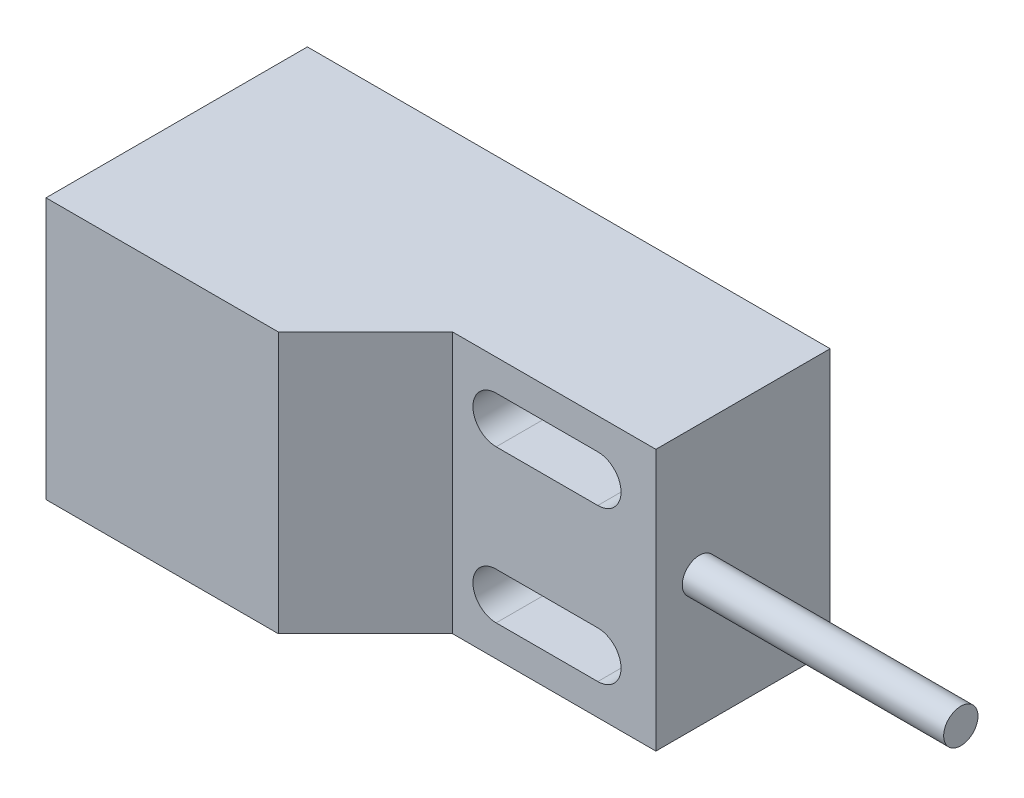
ISO-10303-21;
HEADER;
FILE_DESCRIPTION(('STEP AP214'),'2;1');
FILE_NAME('part.step','',(''),(''),'','','');
FILE_SCHEMA(('AUTOMOTIVE_DESIGN { 1 0 10303 214 1 1 1 1 }'));
ENDSEC;
DATA;
#1=APPLICATION_CONTEXT('core data for automotive mechanical design processes');
#2=APPLICATION_PROTOCOL_DEFINITION('international standard','automotive_design',2000,#1);
#3=PRODUCT_CONTEXT('',#1,'mechanical');
#4=PRODUCT('Part','Part','',(#3));
#5=PRODUCT_RELATED_PRODUCT_CATEGORY('part','',(#4));
#6=PRODUCT_DEFINITION_FORMATION('','',#4);
#7=PRODUCT_DEFINITION_CONTEXT('part definition',#1,'design');
#8=PRODUCT_DEFINITION('design','',#6,#7);
#9=PRODUCT_DEFINITION_SHAPE('','',#8);
#10=(LENGTH_UNIT() NAMED_UNIT(*) SI_UNIT(.MILLI.,.METRE.));
#11=(NAMED_UNIT(*) PLANE_ANGLE_UNIT() SI_UNIT($,.RADIAN.));
#12=(NAMED_UNIT(*) SI_UNIT($,.STERADIAN.) SOLID_ANGLE_UNIT());
#13=UNCERTAINTY_MEASURE_WITH_UNIT(LENGTH_MEASURE(1.E-05),#10,'distance_accuracy_value','');
#14=(GEOMETRIC_REPRESENTATION_CONTEXT(3) GLOBAL_UNCERTAINTY_ASSIGNED_CONTEXT((#13)) GLOBAL_UNIT_ASSIGNED_CONTEXT((#10,
#11,#12)) REPRESENTATION_CONTEXT('',''));
#15=CARTESIAN_POINT('',(0.,0.,0.));
#16=DIRECTION('',(0.,0.,1.));
#17=DIRECTION('',(1.,0.,0.));
#18=AXIS2_PLACEMENT_3D('',#15,#16,#17);
#19=CARTESIAN_POINT('',(18.,9.,9.));
#20=DIRECTION('',(-1.,0.,0.));
#21=DIRECTION('',(0.,0.,1.));
#22=AXIS2_PLACEMENT_3D('',#19,#20,#21);
#23=PLANE('',#22);
#24=CARTESIAN_POINT('',(18.,0.,0.));
#25=DIRECTION('',(-1.,0.,0.));
#26=DIRECTION('',(0.,0.,1.));
#27=AXIS2_PLACEMENT_3D('',#24,#25,#26);
#28=CIRCLE('',#27,1.18261281778891);
#29=CARTESIAN_POINT('',(18.,0.,1.18261281778891));
#30=VERTEX_POINT('',#29);
#31=EDGE_CURVE('E11',#30,#30,#28,.F.);
#32=ORIENTED_EDGE('',*,*,#31,.F.);
#33=EDGE_LOOP('',(#32));
#34=FACE_BOUND('',#33,.T.);
#35=DIRECTION('',(0.,0.,-1.));
#36=VECTOR('',#35,1.);
#37=CARTESIAN_POINT('',(18.,9.,9.));
#38=LINE('',#37,#36);
#39=CARTESIAN_POINT('',(18.,9.,3.));
#40=VERTEX_POINT('',#39);
#41=CARTESIAN_POINT('',(18.,9.,-9.));
#42=VERTEX_POINT('',#41);
#43=EDGE_CURVE('E40',#40,#42,#38,.T.);
#44=ORIENTED_EDGE('',*,*,#43,.F.);
#45=DIRECTION('',(0.,-1.,0.));
#46=VECTOR('',#45,1.);
#47=CARTESIAN_POINT('',(18.,9.,3.));
#48=LINE('',#47,#46);
#49=CARTESIAN_POINT('',(18.,-9.,3.));
#50=VERTEX_POINT('',#49);
#51=EDGE_CURVE('E218',#40,#50,#48,.T.);
#52=ORIENTED_EDGE('',*,*,#51,.T.);
#53=DIRECTION('',(0.,0.,-1.));
#54=VECTOR('',#53,1.);
#55=CARTESIAN_POINT('',(18.,-9.,9.));
#56=LINE('',#55,#54);
#57=CARTESIAN_POINT('',(18.,-9.,-9.));
#58=VERTEX_POINT('',#57);
#59=EDGE_CURVE('E233',#50,#58,#56,.T.);
#60=ORIENTED_EDGE('',*,*,#59,.T.);
#61=DIRECTION('',(0.,1.,0.));
#62=VECTOR('',#61,1.);
#63=CARTESIAN_POINT('',(18.,9.,-9.));
#64=LINE('',#63,#62);
#65=EDGE_CURVE('E221',#58,#42,#64,.T.);
#66=ORIENTED_EDGE('',*,*,#65,.T.);
#67=EDGE_LOOP('',(#44,#52,#60,#66));
#68=FACE_BOUND('',#67,.T.);
#69=ADVANCED_FACE('F33',(#34,#68),#23,.F.);
#70=CARTESIAN_POINT('',(-18.,9.,9.));
#71=DIRECTION('',(0.,-1.,0.));
#72=DIRECTION('',(0.,0.,-1.));
#73=AXIS2_PLACEMENT_3D('',#70,#71,#72);
#74=PLANE('',#73);
#75=DIRECTION('',(0.707106781186551,0.,-0.707106781186543));
#76=VECTOR('',#75,1.);
#77=CARTESIAN_POINT('',(-1.99999999999999,9.,9.));
#78=LINE('',#77,#76);
#79=CARTESIAN_POINT('',(-1.99999999999999,9.,9.));
#80=VERTEX_POINT('',#79);
#81=CARTESIAN_POINT('',(4.00000000000007,9.,3.));
#82=VERTEX_POINT('',#81);
#83=EDGE_CURVE('E207',#80,#82,#78,.T.);
#84=ORIENTED_EDGE('',*,*,#83,.T.);
#85=DIRECTION('',(1.,0.,0.));
#86=VECTOR('',#85,1.);
#87=CARTESIAN_POINT('',(4.00000000000007,9.,3.));
#88=LINE('',#87,#86);
#89=EDGE_CURVE('E210',#82,#40,#88,.T.);
#90=ORIENTED_EDGE('',*,*,#89,.T.);
#91=ORIENTED_EDGE('',*,*,#43,.T.);
#92=DIRECTION('',(-1.,0.,0.));
#93=VECTOR('',#92,1.);
#94=CARTESIAN_POINT('',(-18.,9.,-9.));
#95=LINE('',#94,#93);
#96=CARTESIAN_POINT('',(-18.,9.,-9.));
#97=VERTEX_POINT('',#96);
#98=EDGE_CURVE('E236',#42,#97,#95,.T.);
#99=ORIENTED_EDGE('',*,*,#98,.T.);
#100=DIRECTION('',(0.,0.,-1.));
#101=VECTOR('',#100,1.);
#102=CARTESIAN_POINT('',(-18.,9.,9.));
#103=LINE('',#102,#101);
#104=CARTESIAN_POINT('',(-18.,9.,9.));
#105=VERTEX_POINT('',#104);
#106=EDGE_CURVE('E246',#105,#97,#103,.T.);
#107=ORIENTED_EDGE('',*,*,#106,.F.);
#108=DIRECTION('',(-1.,0.,0.));
#109=VECTOR('',#108,1.);
#110=CARTESIAN_POINT('',(-18.,9.,9.));
#111=LINE('',#110,#109);
#112=EDGE_CURVE('E225',#80,#105,#111,.T.);
#113=ORIENTED_EDGE('',*,*,#112,.F.);
#114=EDGE_LOOP('',(#84,#90,#91,#99,#107,#113));
#115=FACE_BOUND('',#114,.T.);
#116=ADVANCED_FACE('F251',(#115),#74,.F.);
#117=CARTESIAN_POINT('',(-18.,9.,9.));
#118=DIRECTION('',(1.,0.,0.));
#119=DIRECTION('',(0.,0.,-1.));
#120=AXIS2_PLACEMENT_3D('',#117,#118,#119);
#121=PLANE('',#120);
#122=DIRECTION('',(0.,-1.,0.));
#123=VECTOR('',#122,1.);
#124=CARTESIAN_POINT('',(-18.,9.,-9.));
#125=LINE('',#124,#123);
#126=CARTESIAN_POINT('',(-18.,-9.,-9.));
#127=VERTEX_POINT('',#126);
#128=EDGE_CURVE('E238',#97,#127,#125,.T.);
#129=ORIENTED_EDGE('',*,*,#128,.T.);
#130=DIRECTION('',(0.,0.,-1.));
#131=VECTOR('',#130,1.);
#132=CARTESIAN_POINT('',(-18.,-9.,9.));
#133=LINE('',#132,#131);
#134=CARTESIAN_POINT('',(-18.,-9.,9.));
#135=VERTEX_POINT('',#134);
#136=EDGE_CURVE('E243',#135,#127,#133,.T.);
#137=ORIENTED_EDGE('',*,*,#136,.F.);
#138=DIRECTION('',(0.,-1.,0.));
#139=VECTOR('',#138,1.);
#140=CARTESIAN_POINT('',(-18.,9.,9.));
#141=LINE('',#140,#139);
#142=EDGE_CURVE('E227',#105,#135,#141,.T.);
#143=ORIENTED_EDGE('',*,*,#142,.F.);
#144=ORIENTED_EDGE('',*,*,#106,.T.);
#145=EDGE_LOOP('',(#129,#137,#143,#144));
#146=FACE_BOUND('',#145,.T.);
#147=ADVANCED_FACE('F268',(#146),#121,.F.);
#148=CARTESIAN_POINT('',(-18.,-9.,9.));
#149=DIRECTION('',(0.,1.,0.));
#150=DIRECTION('',(0.,0.,1.));
#151=AXIS2_PLACEMENT_3D('',#148,#149,#150);
#152=PLANE('',#151);
#153=ORIENTED_EDGE('',*,*,#59,.F.);
#154=DIRECTION('',(1.,0.,0.));
#155=VECTOR('',#154,1.);
#156=CARTESIAN_POINT('',(4.00000000000007,-9.,3.));
#157=LINE('',#156,#155);
#158=CARTESIAN_POINT('',(4.00000000000007,-9.,3.));
#159=VERTEX_POINT('',#158);
#160=EDGE_CURVE('E211',#159,#50,#157,.T.);
#161=ORIENTED_EDGE('',*,*,#160,.F.);
#162=DIRECTION('',(0.707106781186551,0.,-0.707106781186543));
#163=VECTOR('',#162,1.);
#164=CARTESIAN_POINT('',(-1.99999999999999,-9.,9.));
#165=LINE('',#164,#163);
#166=CARTESIAN_POINT('',(-1.99999999999999,-9.,9.));
#167=VERTEX_POINT('',#166);
#168=EDGE_CURVE('E206',#167,#159,#165,.T.);
#169=ORIENTED_EDGE('',*,*,#168,.F.);
#170=DIRECTION('',(1.,0.,0.));
#171=VECTOR('',#170,1.);
#172=CARTESIAN_POINT('',(-18.,-9.,9.));
#173=LINE('',#172,#171);
#174=EDGE_CURVE('E230',#135,#167,#173,.T.);
#175=ORIENTED_EDGE('',*,*,#174,.F.);
#176=ORIENTED_EDGE('',*,*,#136,.T.);
#177=DIRECTION('',(1.,0.,0.));
#178=VECTOR('',#177,1.);
#179=CARTESIAN_POINT('',(-18.,-9.,-9.));
#180=LINE('',#179,#178);
#181=EDGE_CURVE('E228',#127,#58,#180,.T.);
#182=ORIENTED_EDGE('',*,*,#181,.T.);
#183=EDGE_LOOP('',(#153,#161,#169,#175,#176,#182));
#184=FACE_BOUND('',#183,.T.);
#185=ADVANCED_FACE('F262',(#184),#152,.F.);
#186=CARTESIAN_POINT('',(0.,0.,9.));
#187=DIRECTION('',(0.,0.,1.));
#188=DIRECTION('',(1.,0.,0.));
#189=AXIS2_PLACEMENT_3D('',#186,#187,#188);
#190=PLANE('',#189);
#191=DIRECTION('',(0.,-1.,0.));
#192=VECTOR('',#191,1.);
#193=CARTESIAN_POINT('',(-1.99999999999999,9.,9.));
#194=LINE('',#193,#192);
#195=EDGE_CURVE('E214',#80,#167,#194,.T.);
#196=ORIENTED_EDGE('',*,*,#195,.F.);
#197=ORIENTED_EDGE('',*,*,#112,.T.);
#198=ORIENTED_EDGE('',*,*,#142,.T.);
#199=ORIENTED_EDGE('',*,*,#174,.T.);
#200=EDGE_LOOP('',(#196,#197,#198,#199));
#201=FACE_BOUND('',#200,.T.);
#202=ADVANCED_FACE('F272',(#201),#190,.T.);
#203=CARTESIAN_POINT('',(0.,0.,-9.));
#204=DIRECTION('',(0.,0.,1.));
#205=DIRECTION('',(1.,0.,0.));
#206=AXIS2_PLACEMENT_3D('',#203,#204,#205);
#207=PLANE('',#206);
#208=DIRECTION('',(-1.,0.,0.));
#209=VECTOR('',#208,1.);
#210=CARTESIAN_POINT('',(7.00000000000001,6.85,-9.));
#211=LINE('',#210,#209);
#212=CARTESIAN_POINT('',(14.,6.85,-9.));
#213=VERTEX_POINT('',#212);
#214=CARTESIAN_POINT('',(7.00000000000001,6.85,-9.));
#215=VERTEX_POINT('',#214);
#216=EDGE_CURVE('E145',#213,#215,#211,.T.);
#217=ORIENTED_EDGE('',*,*,#216,.T.);
#218=CARTESIAN_POINT('',(7.00000000000001,5.25,-9.));
#219=DIRECTION('',(0.,0.,1.));
#220=DIRECTION('',(1.,0.,0.));
#221=AXIS2_PLACEMENT_3D('',#218,#219,#220);
#222=CIRCLE('',#221,1.6);
#223=CARTESIAN_POINT('',(7.00000000000001,3.65,-9.));
#224=VERTEX_POINT('',#223);
#225=EDGE_CURVE('E137',#215,#224,#222,.T.);
#226=ORIENTED_EDGE('',*,*,#225,.T.);
#227=DIRECTION('',(1.,0.,0.));
#228=VECTOR('',#227,1.);
#229=CARTESIAN_POINT('',(7.00000000000001,3.65,-9.));
#230=LINE('',#229,#228);
#231=CARTESIAN_POINT('',(14.,3.65,-9.));
#232=VERTEX_POINT('',#231);
#233=EDGE_CURVE('E148',#224,#232,#230,.T.);
#234=ORIENTED_EDGE('',*,*,#233,.T.);
#235=CARTESIAN_POINT('',(14.,5.25,-9.));
#236=DIRECTION('',(0.,0.,1.));
#237=DIRECTION('',(1.,0.,0.));
#238=AXIS2_PLACEMENT_3D('',#235,#236,#237);
#239=CIRCLE('',#238,1.6);
#240=EDGE_CURVE('E47',#232,#213,#239,.T.);
#241=ORIENTED_EDGE('',*,*,#240,.T.);
#242=EDGE_LOOP('',(#217,#226,#234,#241));
#243=FACE_BOUND('',#242,.T.);
#244=DIRECTION('',(-1.,0.,0.));
#245=VECTOR('',#244,1.);
#246=CARTESIAN_POINT('',(7.00000000000001,-3.65,-9.));
#247=LINE('',#246,#245);
#248=CARTESIAN_POINT('',(14.,-3.65,-9.));
#249=VERTEX_POINT('',#248);
#250=CARTESIAN_POINT('',(7.00000000000001,-3.65,-9.));
#251=VERTEX_POINT('',#250);
#252=EDGE_CURVE('E183',#249,#251,#247,.T.);
#253=ORIENTED_EDGE('',*,*,#252,.T.);
#254=CARTESIAN_POINT('',(7.00000000000001,-5.25,-9.));
#255=DIRECTION('',(0.,0.,1.));
#256=DIRECTION('',(-1.,0.,0.));
#257=AXIS2_PLACEMENT_3D('',#254,#255,#256);
#258=CIRCLE('',#257,1.6);
#259=CARTESIAN_POINT('',(7.00000000000001,-6.85,-9.));
#260=VERTEX_POINT('',#259);
#261=EDGE_CURVE('E175',#251,#260,#258,.T.);
#262=ORIENTED_EDGE('',*,*,#261,.T.);
#263=DIRECTION('',(1.,0.,0.));
#264=VECTOR('',#263,1.);
#265=CARTESIAN_POINT('',(7.00000000000001,-6.85,-9.));
#266=LINE('',#265,#264);
#267=CARTESIAN_POINT('',(14.,-6.85,-9.));
#268=VERTEX_POINT('',#267);
#269=EDGE_CURVE('E178',#260,#268,#266,.T.);
#270=ORIENTED_EDGE('',*,*,#269,.T.);
#271=CARTESIAN_POINT('',(14.,-5.25,-9.));
#272=DIRECTION('',(0.,0.,1.));
#273=DIRECTION('',(-1.,0.,0.));
#274=AXIS2_PLACEMENT_3D('',#271,#272,#273);
#275=CIRCLE('',#274,1.6);
#276=EDGE_CURVE('E55',#268,#249,#275,.T.);
#277=ORIENTED_EDGE('',*,*,#276,.T.);
#278=EDGE_LOOP('',(#253,#262,#270,#277));
#279=FACE_BOUND('',#278,.T.);
#280=ORIENTED_EDGE('',*,*,#65,.F.);
#281=ORIENTED_EDGE('',*,*,#181,.F.);
#282=ORIENTED_EDGE('',*,*,#128,.F.);
#283=ORIENTED_EDGE('',*,*,#98,.F.);
#284=EDGE_LOOP('',(#280,#281,#282,#283));
#285=FACE_BOUND('',#284,.T.);
#286=ADVANCED_FACE('F152',(#243,#279,#285),#207,.F.);
#287=CARTESIAN_POINT('',(4.00000000000007,9.,3.));
#288=DIRECTION('',(0.,0.,-1.));
#289=DIRECTION('',(-1.,0.,0.));
#290=AXIS2_PLACEMENT_3D('',#287,#288,#289);
#291=PLANE('',#290);
#292=DIRECTION('',(1.,0.,0.));
#293=VECTOR('',#292,1.);
#294=CARTESIAN_POINT('',(7.00000000000001,3.65,3.));
#295=LINE('',#294,#293);
#296=CARTESIAN_POINT('',(7.00000000000001,3.65,3.));
#297=VERTEX_POINT('',#296);
#298=CARTESIAN_POINT('',(14.,3.65,3.));
#299=VERTEX_POINT('',#298);
#300=EDGE_CURVE('E164',#297,#299,#295,.T.);
#301=ORIENTED_EDGE('',*,*,#300,.F.);
#302=CARTESIAN_POINT('',(7.00000000000001,5.25,3.));
#303=DIRECTION('',(0.,0.,1.));
#304=DIRECTION('',(1.,0.,0.));
#305=AXIS2_PLACEMENT_3D('',#302,#303,#304);
#306=CIRCLE('',#305,1.6);
#307=CARTESIAN_POINT('',(7.00000000000001,6.85,3.));
#308=VERTEX_POINT('',#307);
#309=EDGE_CURVE('E140',#308,#297,#306,.T.);
#310=ORIENTED_EDGE('',*,*,#309,.F.);
#311=DIRECTION('',(-1.,0.,0.));
#312=VECTOR('',#311,1.);
#313=CARTESIAN_POINT('',(7.00000000000001,6.85,3.));
#314=LINE('',#313,#312);
#315=CARTESIAN_POINT('',(14.,6.85,3.));
#316=VERTEX_POINT('',#315);
#317=EDGE_CURVE('E155',#316,#308,#314,.T.);
#318=ORIENTED_EDGE('',*,*,#317,.F.);
#319=CARTESIAN_POINT('',(14.,5.25,3.));
#320=DIRECTION('',(0.,0.,1.));
#321=DIRECTION('',(1.,0.,0.));
#322=AXIS2_PLACEMENT_3D('',#319,#320,#321);
#323=CIRCLE('',#322,1.6);
#324=EDGE_CURVE('E158',#299,#316,#323,.T.);
#325=ORIENTED_EDGE('',*,*,#324,.F.);
#326=EDGE_LOOP('',(#301,#310,#318,#325));
#327=FACE_BOUND('',#326,.T.);
#328=DIRECTION('',(1.,0.,0.));
#329=VECTOR('',#328,1.);
#330=CARTESIAN_POINT('',(7.00000000000001,-6.85,3.));
#331=LINE('',#330,#329);
#332=CARTESIAN_POINT('',(7.00000000000001,-6.85,3.));
#333=VERTEX_POINT('',#332);
#334=CARTESIAN_POINT('',(14.,-6.85,3.));
#335=VERTEX_POINT('',#334);
#336=EDGE_CURVE('E189',#333,#335,#331,.T.);
#337=ORIENTED_EDGE('',*,*,#336,.F.);
#338=CARTESIAN_POINT('',(7.00000000000001,-5.25,3.));
#339=DIRECTION('',(0.,0.,1.));
#340=DIRECTION('',(-1.,0.,0.));
#341=AXIS2_PLACEMENT_3D('',#338,#339,#340);
#342=CIRCLE('',#341,1.6);
#343=CARTESIAN_POINT('',(7.00000000000001,-3.65,3.));
#344=VERTEX_POINT('',#343);
#345=EDGE_CURVE('E187',#344,#333,#342,.T.);
#346=ORIENTED_EDGE('',*,*,#345,.F.);
#347=DIRECTION('',(-1.,0.,0.));
#348=VECTOR('',#347,1.);
#349=CARTESIAN_POINT('',(7.00000000000001,-3.65,3.));
#350=LINE('',#349,#348);
#351=CARTESIAN_POINT('',(14.,-3.65,3.));
#352=VERTEX_POINT('',#351);
#353=EDGE_CURVE('E179',#352,#344,#350,.T.);
#354=ORIENTED_EDGE('',*,*,#353,.F.);
#355=CARTESIAN_POINT('',(14.,-5.25,3.));
#356=DIRECTION('',(0.,0.,1.));
#357=DIRECTION('',(-1.,0.,0.));
#358=AXIS2_PLACEMENT_3D('',#355,#356,#357);
#359=CIRCLE('',#358,1.6);
#360=EDGE_CURVE('E192',#335,#352,#359,.T.);
#361=ORIENTED_EDGE('',*,*,#360,.F.);
#362=EDGE_LOOP('',(#337,#346,#354,#361));
#363=FACE_BOUND('',#362,.T.);
#364=ORIENTED_EDGE('',*,*,#160,.T.);
#365=ORIENTED_EDGE('',*,*,#51,.F.);
#366=ORIENTED_EDGE('',*,*,#89,.F.);
#367=DIRECTION('',(0.,-1.,0.));
#368=VECTOR('',#367,1.);
#369=CARTESIAN_POINT('',(4.00000000000007,9.,3.));
#370=LINE('',#369,#368);
#371=EDGE_CURVE('E222',#82,#159,#370,.T.);
#372=ORIENTED_EDGE('',*,*,#371,.T.);
#373=EDGE_LOOP('',(#364,#365,#366,#372));
#374=FACE_BOUND('',#373,.T.);
#375=ADVANCED_FACE('F276',(#327,#363,#374),#291,.F.);
#376=CARTESIAN_POINT('',(-1.99999999999999,9.,9.));
#377=DIRECTION('',(-0.707106781186544,0.,-0.707106781186552));
#378=DIRECTION('',(-0.707106781186552,0.,0.707106781186544));
#379=AXIS2_PLACEMENT_3D('',#376,#377,#378);
#380=PLANE('',#379);
#381=ORIENTED_EDGE('',*,*,#168,.T.);
#382=ORIENTED_EDGE('',*,*,#371,.F.);
#383=ORIENTED_EDGE('',*,*,#83,.F.);
#384=ORIENTED_EDGE('',*,*,#195,.T.);
#385=EDGE_LOOP('',(#381,#382,#383,#384));
#386=FACE_BOUND('',#385,.T.);
#387=ADVANCED_FACE('F274',(#386),#380,.F.);
#388=CARTESIAN_POINT('',(36.,0.,0.));
#389=DIRECTION('',(-1.,0.,0.));
#390=DIRECTION('',(0.,0.,1.));
#391=AXIS2_PLACEMENT_3D('',#388,#389,#390);
#392=CYLINDRICAL_SURFACE('',#391,1.18261281778891);
#393=CARTESIAN_POINT('',(36.,0.,0.));
#394=DIRECTION('',(1.,0.,0.));
#395=DIRECTION('',(0.,0.,-1.));
#396=AXIS2_PLACEMENT_3D('',#393,#394,#395);
#397=CIRCLE('',#396,1.18261281778891);
#398=CARTESIAN_POINT('',(36.,0.,-1.18261281778891));
#399=VERTEX_POINT('',#398);
#400=EDGE_CURVE('E171',#399,#399,#397,.T.);
#401=ORIENTED_EDGE('',*,*,#400,.F.);
#402=EDGE_LOOP('',(#401));
#403=FACE_BOUND('',#402,.T.);
#404=ORIENTED_EDGE('',*,*,#31,.T.);
#405=EDGE_LOOP('',(#404));
#406=FACE_BOUND('',#405,.T.);
#407=ADVANCED_FACE('F284',(#403,#406),#392,.T.);
#408=CARTESIAN_POINT('',(36.,0.,0.));
#409=DIRECTION('',(1.,0.,0.));
#410=DIRECTION('',(0.,0.,-1.));
#411=AXIS2_PLACEMENT_3D('',#408,#409,#410);
#412=PLANE('',#411);
#413=ORIENTED_EDGE('',*,*,#400,.T.);
#414=EDGE_LOOP('',(#413));
#415=FACE_BOUND('',#414,.T.);
#416=ADVANCED_FACE('F297',(#415),#412,.T.);
#417=CARTESIAN_POINT('',(7.00000000000001,-5.25,-9.));
#418=DIRECTION('',(0.,0.,1.));
#419=DIRECTION('',(1.,0.,0.));
#420=AXIS2_PLACEMENT_3D('',#417,#418,#419);
#421=CYLINDRICAL_SURFACE('',#420,1.6);
#422=ORIENTED_EDGE('',*,*,#345,.T.);
#423=DIRECTION('',(0.,0.,1.));
#424=VECTOR('',#423,1.);
#425=CARTESIAN_POINT('',(7.00000000000001,-6.85,-9.));
#426=LINE('',#425,#424);
#427=EDGE_CURVE('E186',#260,#333,#426,.T.);
#428=ORIENTED_EDGE('',*,*,#427,.F.);
#429=ORIENTED_EDGE('',*,*,#261,.F.);
#430=DIRECTION('',(0.,0.,1.));
#431=VECTOR('',#430,1.);
#432=CARTESIAN_POINT('',(7.00000000000001,-3.65,-9.));
#433=LINE('',#432,#431);
#434=EDGE_CURVE('E165',#251,#344,#433,.T.);
#435=ORIENTED_EDGE('',*,*,#434,.T.);
#436=EDGE_LOOP('',(#422,#428,#429,#435));
#437=FACE_BOUND('',#436,.T.);
#438=ADVANCED_FACE('F302',(#437),#421,.F.);
#439=CARTESIAN_POINT('',(7.00000000000001,-3.65,-9.));
#440=DIRECTION('',(0.,1.,0.));
#441=DIRECTION('',(0.,0.,1.));
#442=AXIS2_PLACEMENT_3D('',#439,#440,#441);
#443=PLANE('',#442);
#444=ORIENTED_EDGE('',*,*,#353,.T.);
#445=ORIENTED_EDGE('',*,*,#434,.F.);
#446=ORIENTED_EDGE('',*,*,#252,.F.);
#447=DIRECTION('',(0.,0.,1.));
#448=VECTOR('',#447,1.);
#449=CARTESIAN_POINT('',(14.,-3.65,-9.));
#450=LINE('',#449,#448);
#451=EDGE_CURVE('E198',#249,#352,#450,.T.);
#452=ORIENTED_EDGE('',*,*,#451,.T.);
#453=EDGE_LOOP('',(#444,#445,#446,#452));
#454=FACE_BOUND('',#453,.T.);
#455=ADVANCED_FACE('F309',(#454),#443,.F.);
#456=CARTESIAN_POINT('',(14.,-5.25,-9.));
#457=DIRECTION('',(0.,0.,1.));
#458=DIRECTION('',(1.,0.,0.));
#459=AXIS2_PLACEMENT_3D('',#456,#457,#458);
#460=CYLINDRICAL_SURFACE('',#459,1.6);
#461=ORIENTED_EDGE('',*,*,#360,.T.);
#462=ORIENTED_EDGE('',*,*,#451,.F.);
#463=ORIENTED_EDGE('',*,*,#276,.F.);
#464=DIRECTION('',(0.,0.,1.));
#465=VECTOR('',#464,1.);
#466=CARTESIAN_POINT('',(14.,-6.85,-9.));
#467=LINE('',#466,#465);
#468=EDGE_CURVE('E200',#268,#335,#467,.T.);
#469=ORIENTED_EDGE('',*,*,#468,.T.);
#470=EDGE_LOOP('',(#461,#462,#463,#469));
#471=FACE_BOUND('',#470,.T.);
#472=ADVANCED_FACE('F314',(#471),#460,.F.);
#473=CARTESIAN_POINT('',(7.00000000000001,-6.85,-9.));
#474=DIRECTION('',(0.,-1.,0.));
#475=DIRECTION('',(0.,0.,-1.));
#476=AXIS2_PLACEMENT_3D('',#473,#474,#475);
#477=PLANE('',#476);
#478=ORIENTED_EDGE('',*,*,#336,.T.);
#479=ORIENTED_EDGE('',*,*,#468,.F.);
#480=ORIENTED_EDGE('',*,*,#269,.F.);
#481=ORIENTED_EDGE('',*,*,#427,.T.);
#482=EDGE_LOOP('',(#478,#479,#480,#481));
#483=FACE_BOUND('',#482,.T.);
#484=ADVANCED_FACE('F311',(#483),#477,.F.);
#485=CARTESIAN_POINT('',(7.00000000000001,5.25,-9.));
#486=DIRECTION('',(0.,0.,1.));
#487=DIRECTION('',(1.,0.,0.));
#488=AXIS2_PLACEMENT_3D('',#485,#486,#487);
#489=CYLINDRICAL_SURFACE('',#488,1.6);
#490=ORIENTED_EDGE('',*,*,#309,.T.);
#491=DIRECTION('',(0.,0.,1.));
#492=VECTOR('',#491,1.);
#493=CARTESIAN_POINT('',(7.00000000000001,3.65,-9.));
#494=LINE('',#493,#492);
#495=EDGE_CURVE('E133',#224,#297,#494,.T.);
#496=ORIENTED_EDGE('',*,*,#495,.F.);
#497=ORIENTED_EDGE('',*,*,#225,.F.);
#498=DIRECTION('',(0.,0.,1.));
#499=VECTOR('',#498,1.);
#500=CARTESIAN_POINT('',(7.00000000000001,6.85,-9.));
#501=LINE('',#500,#499);
#502=EDGE_CURVE('E169',#215,#308,#501,.T.);
#503=ORIENTED_EDGE('',*,*,#502,.T.);
#504=EDGE_LOOP('',(#490,#496,#497,#503));
#505=FACE_BOUND('',#504,.T.);
#506=ADVANCED_FACE('F135',(#505),#489,.F.);
#507=CARTESIAN_POINT('',(7.00000000000001,6.85,-9.));
#508=DIRECTION('',(0.,1.,0.));
#509=DIRECTION('',(0.,0.,1.));
#510=AXIS2_PLACEMENT_3D('',#507,#508,#509);
#511=PLANE('',#510);
#512=ORIENTED_EDGE('',*,*,#317,.T.);
#513=ORIENTED_EDGE('',*,*,#502,.F.);
#514=ORIENTED_EDGE('',*,*,#216,.F.);
#515=DIRECTION('',(0.,0.,1.));
#516=VECTOR('',#515,1.);
#517=CARTESIAN_POINT('',(14.,6.85,-9.));
#518=LINE('',#517,#516);
#519=EDGE_CURVE('E172',#213,#316,#518,.T.);
#520=ORIENTED_EDGE('',*,*,#519,.T.);
#521=EDGE_LOOP('',(#512,#513,#514,#520));
#522=FACE_BOUND('',#521,.T.);
#523=ADVANCED_FACE('F323',(#522),#511,.F.);
#524=CARTESIAN_POINT('',(14.,5.25,-9.));
#525=DIRECTION('',(0.,0.,1.));
#526=DIRECTION('',(1.,0.,0.));
#527=AXIS2_PLACEMENT_3D('',#524,#525,#526);
#528=CYLINDRICAL_SURFACE('',#527,1.6);
#529=ORIENTED_EDGE('',*,*,#324,.T.);
#530=ORIENTED_EDGE('',*,*,#519,.F.);
#531=ORIENTED_EDGE('',*,*,#240,.F.);
#532=DIRECTION('',(0.,0.,1.));
#533=VECTOR('',#532,1.);
#534=CARTESIAN_POINT('',(14.,3.65,-9.));
#535=LINE('',#534,#533);
#536=EDGE_CURVE('E144',#232,#299,#535,.T.);
#537=ORIENTED_EDGE('',*,*,#536,.T.);
#538=EDGE_LOOP('',(#529,#530,#531,#537));
#539=FACE_BOUND('',#538,.T.);
#540=ADVANCED_FACE('F326',(#539),#528,.F.);
#541=CARTESIAN_POINT('',(7.00000000000001,3.65,-9.));
#542=DIRECTION('',(0.,-1.,0.));
#543=DIRECTION('',(0.,0.,-1.));
#544=AXIS2_PLACEMENT_3D('',#541,#542,#543);
#545=PLANE('',#544);
#546=ORIENTED_EDGE('',*,*,#300,.T.);
#547=ORIENTED_EDGE('',*,*,#536,.F.);
#548=ORIENTED_EDGE('',*,*,#233,.F.);
#549=ORIENTED_EDGE('',*,*,#495,.T.);
#550=EDGE_LOOP('',(#546,#547,#548,#549));
#551=FACE_BOUND('',#550,.T.);
#552=ADVANCED_FACE('F149',(#551),#545,.F.);
#553=CLOSED_SHELL('',(#69,#116,#147,#185,#202,#286,#375,#387,#407,#416,#438,#455,#472,#484,#506,
#523,#540,#552));
#554=MANIFOLD_SOLID_BREP('B2',#553);
#555=ADVANCED_BREP_SHAPE_REPRESENTATION('',(#18,#554),#14);
#556=SHAPE_DEFINITION_REPRESENTATION(#9,#555);
ENDSEC;
END-ISO-10303-21;
